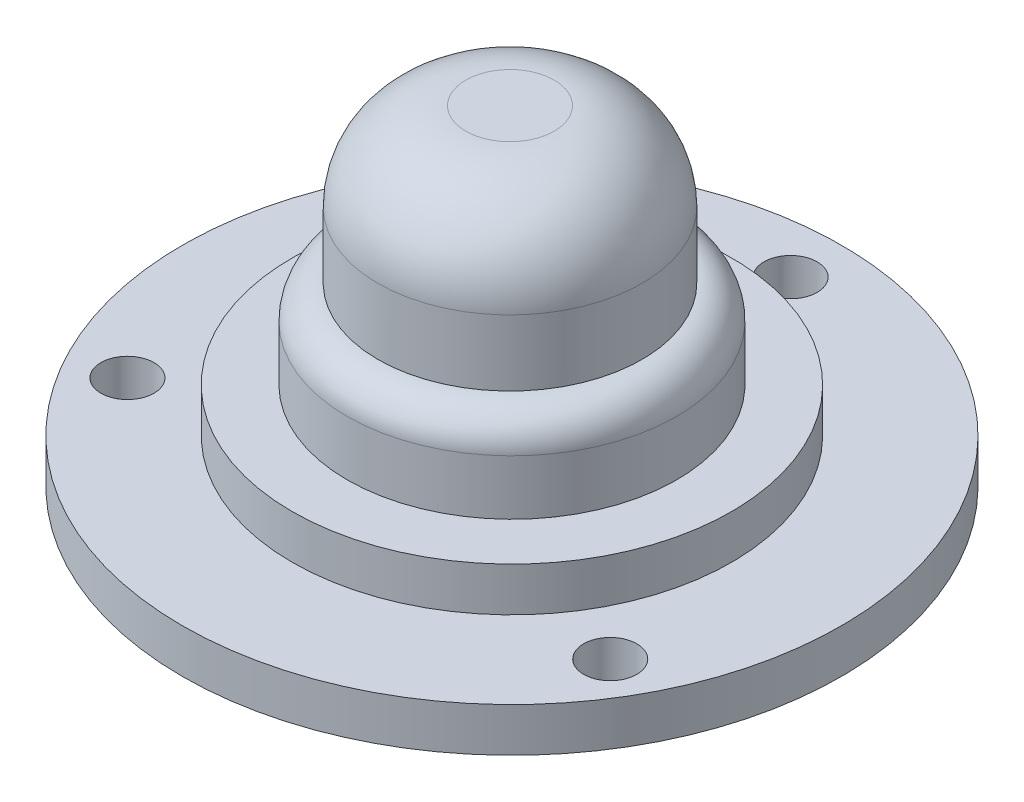
ISO-10303-21;
HEADER;
FILE_DESCRIPTION(('STEP AP214'),'2;1');
FILE_NAME('part.step','',(''),(''),'','','');
FILE_SCHEMA(('AUTOMOTIVE_DESIGN { 1 0 10303 214 1 1 1 1 }'));
ENDSEC;
DATA;
#1=APPLICATION_CONTEXT('core data for automotive mechanical design processes');
#2=APPLICATION_PROTOCOL_DEFINITION('international standard','automotive_design',2000,#1);
#3=PRODUCT_CONTEXT('',#1,'mechanical');
#4=PRODUCT('Part','Part','',(#3));
#5=PRODUCT_RELATED_PRODUCT_CATEGORY('part','',(#4));
#6=PRODUCT_DEFINITION_FORMATION('','',#4);
#7=PRODUCT_DEFINITION_CONTEXT('part definition',#1,'design');
#8=PRODUCT_DEFINITION('design','',#6,#7);
#9=PRODUCT_DEFINITION_SHAPE('','',#8);
#10=(LENGTH_UNIT() NAMED_UNIT(*) SI_UNIT(.MILLI.,.METRE.));
#11=(NAMED_UNIT(*) PLANE_ANGLE_UNIT() SI_UNIT($,.RADIAN.));
#12=(NAMED_UNIT(*) SI_UNIT($,.STERADIAN.) SOLID_ANGLE_UNIT());
#13=UNCERTAINTY_MEASURE_WITH_UNIT(LENGTH_MEASURE(1.E-05),#10,'distance_accuracy_value','');
#14=(GEOMETRIC_REPRESENTATION_CONTEXT(3) GLOBAL_UNCERTAINTY_ASSIGNED_CONTEXT((#13)) GLOBAL_UNIT_ASSIGNED_CONTEXT((#10,
#11,#12)) REPRESENTATION_CONTEXT('',''));
#15=CARTESIAN_POINT('',(0.,0.,0.));
#16=DIRECTION('',(0.,0.,1.));
#17=DIRECTION('',(1.,0.,0.));
#18=AXIS2_PLACEMENT_3D('',#15,#16,#17);
#19=CARTESIAN_POINT('',(-0.771907225552136,0.2,-1.32863677318487));
#20=DIRECTION('',(0.,-1.,0.));
#21=DIRECTION('',(0.,0.,-1.));
#22=AXIS2_PLACEMENT_3D('',#19,#20,#21);
#23=CYLINDRICAL_SURFACE('',#22,1.5);
#24=CARTESIAN_POINT('',(-0.771907225552136,0.2,-1.32863677318487));
#25=DIRECTION('',(0.,1.,0.));
#26=DIRECTION('',(0.,0.,1.));
#27=AXIS2_PLACEMENT_3D('',#24,#25,#26);
#28=CIRCLE('',#27,1.5);
#29=CARTESIAN_POINT('',(-0.771907225552136,0.2,0.171363226815129));
#30=VERTEX_POINT('',#29);
#31=EDGE_CURVE('E91',#30,#30,#28,.T.);
#32=ORIENTED_EDGE('',*,*,#31,.F.);
#33=EDGE_LOOP('',(#32));
#34=FACE_BOUND('',#33,.T.);
#35=CARTESIAN_POINT('',(-0.771907225552136,0.,-1.32863677318487));
#36=DIRECTION('',(0.,1.,0.));
#37=DIRECTION('',(0.,0.,1.));
#38=AXIS2_PLACEMENT_3D('',#35,#36,#37);
#39=CIRCLE('',#38,1.5);
#40=CARTESIAN_POINT('',(-0.771907225552136,0.,0.171363226815129));
#41=VERTEX_POINT('',#40);
#42=EDGE_CURVE('E88',#41,#41,#39,.T.);
#43=ORIENTED_EDGE('',*,*,#42,.T.);
#44=EDGE_LOOP('',(#43));
#45=FACE_BOUND('',#44,.T.);
#46=ADVANCED_FACE('F39',(#34,#45),#23,.T.);
#47=CARTESIAN_POINT('',(-0.771907225552136,0.2,-1.32863677318487));
#48=DIRECTION('',(0.,1.,0.));
#49=DIRECTION('',(0.,0.,1.));
#50=AXIS2_PLACEMENT_3D('',#47,#48,#49);
#51=PLANE('',#50);
#52=CARTESIAN_POINT('',(-0.762097507527632,0.2,-2.58705102383207));
#53=DIRECTION('',(0.,1.,0.));
#54=DIRECTION('',(0.,0.,1.));
#55=AXIS2_PLACEMENT_3D('',#52,#53,#54);
#56=CIRCLE('',#55,0.120832219167588);
#57=CARTESIAN_POINT('',(-0.762097507527632,0.2,-2.46621880466448));
#58=VERTEX_POINT('',#57);
#59=EDGE_CURVE('E110',#58,#58,#56,.T.);
#60=ORIENTED_EDGE('',*,*,#59,.F.);
#61=EDGE_LOOP('',(#60));
#62=FACE_BOUND('',#61,.T.);
#63=CARTESIAN_POINT('',(0.333062694347179,0.2,-0.671048980823039));
#64=DIRECTION('',(0.,1.,0.));
#65=DIRECTION('',(0.,0.,1.));
#66=AXIS2_PLACEMENT_3D('',#63,#64,#65);
#67=CIRCLE('',#66,0.120832219167588);
#68=CARTESIAN_POINT('',(0.333062694347179,0.2,-0.550216761655451));
#69=VERTEX_POINT('',#68);
#70=EDGE_CURVE('E273',#69,#69,#67,.T.);
#71=ORIENTED_EDGE('',*,*,#70,.F.);
#72=EDGE_LOOP('',(#71));
#73=FACE_BOUND('',#72,.T.);
#74=CARTESIAN_POINT('',(-1.87382384953893,0.2,-0.680613446290285));
#75=DIRECTION('',(0.,1.,0.));
#76=DIRECTION('',(0.,0.,1.));
#77=AXIS2_PLACEMENT_3D('',#74,#75,#76);
#78=CIRCLE('',#77,0.120832219167588);
#79=CARTESIAN_POINT('',(-1.87382384953893,0.2,-0.559781227122697));
#80=VERTEX_POINT('',#79);
#81=EDGE_CURVE('E276',#80,#80,#78,.T.);
#82=ORIENTED_EDGE('',*,*,#81,.F.);
#83=EDGE_LOOP('',(#82));
#84=FACE_BOUND('',#83,.T.);
#85=CARTESIAN_POINT('',(-0.771907225552136,0.2,-1.32863677318487));
#86=DIRECTION('',(0.,1.,0.));
#87=DIRECTION('',(0.,0.,1.));
#88=AXIS2_PLACEMENT_3D('',#85,#86,#87);
#89=CIRCLE('',#88,1.);
#90=CARTESIAN_POINT('',(-0.771907225552136,0.2,-0.328636773184871));
#91=VERTEX_POINT('',#90);
#92=EDGE_CURVE('E85',#91,#91,#89,.T.);
#93=ORIENTED_EDGE('',*,*,#92,.F.);
#94=EDGE_LOOP('',(#93));
#95=FACE_BOUND('',#94,.T.);
#96=ORIENTED_EDGE('',*,*,#31,.T.);
#97=EDGE_LOOP('',(#96));
#98=FACE_BOUND('',#97,.T.);
#99=ADVANCED_FACE('F133',(#62,#73,#84,#95,#98),#51,.T.);
#100=CARTESIAN_POINT('',(-0.771907225552136,0.,-1.32863677318487));
#101=DIRECTION('',(0.,1.,0.));
#102=DIRECTION('',(0.,0.,1.));
#103=AXIS2_PLACEMENT_3D('',#100,#101,#102);
#104=PLANE('',#103);
#105=CARTESIAN_POINT('',(-0.762097507527632,0.,-2.58705102383207));
#106=DIRECTION('',(0.,1.,0.));
#107=DIRECTION('',(0.,0.,1.));
#108=AXIS2_PLACEMENT_3D('',#105,#106,#107);
#109=CIRCLE('',#108,0.120832219167588);
#110=CARTESIAN_POINT('',(-0.762097507527632,0.,-2.46621880466448));
#111=VERTEX_POINT('',#110);
#112=EDGE_CURVE('E43',#111,#111,#109,.T.);
#113=ORIENTED_EDGE('',*,*,#112,.T.);
#114=EDGE_LOOP('',(#113));
#115=FACE_BOUND('',#114,.T.);
#116=CARTESIAN_POINT('',(0.333062694347179,0.,-0.671048980823039));
#117=DIRECTION('',(0.,1.,0.));
#118=DIRECTION('',(0.,0.,1.));
#119=AXIS2_PLACEMENT_3D('',#116,#117,#118);
#120=CIRCLE('',#119,0.120832219167588);
#121=CARTESIAN_POINT('',(0.333062694347179,0.,-0.550216761655451));
#122=VERTEX_POINT('',#121);
#123=EDGE_CURVE('E75',#122,#122,#120,.T.);
#124=ORIENTED_EDGE('',*,*,#123,.T.);
#125=EDGE_LOOP('',(#124));
#126=FACE_BOUND('',#125,.T.);
#127=CARTESIAN_POINT('',(-1.87382384953893,0.,-0.680613446290285));
#128=DIRECTION('',(0.,1.,0.));
#129=DIRECTION('',(0.,0.,1.));
#130=AXIS2_PLACEMENT_3D('',#127,#128,#129);
#131=CIRCLE('',#130,0.120832219167588);
#132=CARTESIAN_POINT('',(-1.87382384953893,0.,-0.559781227122697));
#133=VERTEX_POINT('',#132);
#134=EDGE_CURVE('E108',#133,#133,#131,.T.);
#135=ORIENTED_EDGE('',*,*,#134,.T.);
#136=EDGE_LOOP('',(#135));
#137=FACE_BOUND('',#136,.T.);
#138=ORIENTED_EDGE('',*,*,#42,.F.);
#139=EDGE_LOOP('',(#138));
#140=FACE_BOUND('',#139,.T.);
#141=ADVANCED_FACE('F114',(#115,#126,#137,#140),#104,.F.);
#142=CARTESIAN_POINT('',(-0.771907225552136,0.4,-1.32863677318487));
#143=DIRECTION('',(0.,-1.,0.));
#144=DIRECTION('',(0.,0.,-1.));
#145=AXIS2_PLACEMENT_3D('',#142,#143,#144);
#146=CYLINDRICAL_SURFACE('',#145,1.);
#147=CARTESIAN_POINT('',(-0.771907225552136,0.4,-1.32863677318487));
#148=DIRECTION('',(0.,1.,0.));
#149=DIRECTION('',(0.,0.,1.));
#150=AXIS2_PLACEMENT_3D('',#147,#148,#149);
#151=CIRCLE('',#150,1.);
#152=CARTESIAN_POINT('',(-0.771907225552136,0.4,-0.328636773184871));
#153=VERTEX_POINT('',#152);
#154=EDGE_CURVE('E64',#153,#153,#151,.T.);
#155=ORIENTED_EDGE('',*,*,#154,.F.);
#156=EDGE_LOOP('',(#155));
#157=FACE_BOUND('',#156,.T.);
#158=ORIENTED_EDGE('',*,*,#92,.T.);
#159=EDGE_LOOP('',(#158));
#160=FACE_BOUND('',#159,.T.);
#161=ADVANCED_FACE('F159',(#157,#160),#146,.T.);
#162=CARTESIAN_POINT('',(-0.771907225552136,0.4,-1.32863677318487));
#163=DIRECTION('',(0.,1.,0.));
#164=DIRECTION('',(0.,0.,1.));
#165=AXIS2_PLACEMENT_3D('',#162,#163,#164);
#166=PLANE('',#165);
#167=CARTESIAN_POINT('',(-0.771907225552136,0.4,-1.32863677318487));
#168=DIRECTION('',(0.,1.,0.));
#169=DIRECTION('',(0.,0.,1.));
#170=AXIS2_PLACEMENT_3D('',#167,#168,#169);
#171=CIRCLE('',#170,0.75);
#172=CARTESIAN_POINT('',(-0.771907225552136,0.4,-0.578636773184871));
#173=VERTEX_POINT('',#172);
#174=EDGE_CURVE('E71',#173,#173,#171,.T.);
#175=ORIENTED_EDGE('',*,*,#174,.F.);
#176=EDGE_LOOP('',(#175));
#177=FACE_BOUND('',#176,.T.);
#178=ORIENTED_EDGE('',*,*,#154,.T.);
#179=EDGE_LOOP('',(#178));
#180=FACE_BOUND('',#179,.T.);
#181=ADVANCED_FACE('F154',(#177,#180),#166,.T.);
#182=CARTESIAN_POINT('',(-0.771907225552136,0.8,-1.32863677318487));
#183=DIRECTION('',(0.,-1.,0.));
#184=DIRECTION('',(0.,0.,-1.));
#185=AXIS2_PLACEMENT_3D('',#182,#183,#184);
#186=CYLINDRICAL_SURFACE('',#185,0.75);
#187=CARTESIAN_POINT('',(-0.771907225552136,0.65,-1.32863677318487));
#188=DIRECTION('',(0.,1.,0.));
#189=DIRECTION('',(0.,0.,1.));
#190=AXIS2_PLACEMENT_3D('',#187,#188,#189);
#191=CIRCLE('',#190,0.75);
#192=CARTESIAN_POINT('',(-0.771907225552136,0.65,-0.578636773184871));
#193=VERTEX_POINT('',#192);
#194=EDGE_CURVE('E70',#193,#193,#191,.F.);
#195=ORIENTED_EDGE('',*,*,#194,.T.);
#196=EDGE_LOOP('',(#195));
#197=FACE_BOUND('',#196,.T.);
#198=ORIENTED_EDGE('',*,*,#174,.T.);
#199=EDGE_LOOP('',(#198));
#200=FACE_BOUND('',#199,.T.);
#201=ADVANCED_FACE('F146',(#197,#200),#186,.T.);
#202=CARTESIAN_POINT('',(-0.771907225552136,0.65,-1.32863677318487));
#203=DIRECTION('',(0.,1.,0.));
#204=DIRECTION('',(0.,0.,1.));
#205=AXIS2_PLACEMENT_3D('',#202,#203,#204);
#206=TOROIDAL_SURFACE('',#205,0.6,0.15);
#207=ORIENTED_EDGE('',*,*,#194,.F.);
#208=EDGE_LOOP('',(#207));
#209=FACE_BOUND('',#208,.T.);
#210=CARTESIAN_POINT('',(-0.776458572665476,0.8,-1.32443257357159));
#211=DIRECTION('',(0.,1.,0.));
#212=DIRECTION('',(0.819867135927403,0.,0.572553822296383));
#213=AXIS2_PLACEMENT_3D('',#210,#211,#212);
#214=CIRCLE('',#213,0.601293838503434);
#215=CARTESIAN_POINT('',(-0.283477515440871,0.8,-0.980159488013188));
#216=VERTEX_POINT('',#215);
#217=CARTESIAN_POINT('',(-1.08062001812605,0.8,-1.84312332471097));
#218=VERTEX_POINT('',#217);
#219=EDGE_CURVE('E58',#216,#218,#214,.T.);
#220=ORIENTED_EDGE('',*,*,#219,.F.);
#221=CARTESIAN_POINT('',(-0.771907225552136,0.8,-1.32863677318487));
#222=DIRECTION('',(0.,1.,0.));
#223=DIRECTION('',(0.,0.,1.));
#224=AXIS2_PLACEMENT_3D('',#221,#222,#223);
#225=CIRCLE('',#224,0.6);
#226=EDGE_CURVE('E55',#218,#216,#225,.T.);
#227=ORIENTED_EDGE('',*,*,#226,.F.);
#228=EDGE_LOOP('',(#220,#227));
#229=FACE_BOUND('',#228,.T.);
#230=ADVANCED_FACE('F60',(#209,#229),#206,.T.);
#231=CARTESIAN_POINT('',(-0.776458572665476,1.5,-1.32443257357159));
#232=DIRECTION('',(0.,-1.,0.));
#233=DIRECTION('',(0.,0.,-1.));
#234=AXIS2_PLACEMENT_3D('',#231,#232,#233);
#235=CYLINDRICAL_SURFACE('',#234,0.601293838503434);
#236=CARTESIAN_POINT('',(-0.776458572665476,1.1,-1.32443257357159));
#237=DIRECTION('',(0.,1.,0.));
#238=DIRECTION('',(0.,0.,1.));
#239=AXIS2_PLACEMENT_3D('',#236,#237,#238);
#240=CIRCLE('',#239,0.601293838503434);
#241=CARTESIAN_POINT('',(-0.776458572665476,1.1,-0.72313873506816));
#242=VERTEX_POINT('',#241);
#243=EDGE_CURVE('E11',#242,#242,#240,.F.);
#244=ORIENTED_EDGE('',*,*,#243,.T.);
#245=EDGE_LOOP('',(#244));
#246=FACE_BOUND('',#245,.T.);
#247=ORIENTED_EDGE('',*,*,#219,.T.);
#248=CARTESIAN_POINT('',(-0.776458572665476,0.8,-1.32443257357159));
#249=DIRECTION('',(0.,1.,0.));
#250=DIRECTION('',(0.,0.,1.));
#251=AXIS2_PLACEMENT_3D('',#248,#249,#250);
#252=CIRCLE('',#251,0.601293838503434);
#253=EDGE_CURVE('E65',#218,#216,#252,.T.);
#254=ORIENTED_EDGE('',*,*,#253,.T.);
#255=EDGE_LOOP('',(#247,#254));
#256=FACE_BOUND('',#255,.T.);
#257=ADVANCED_FACE('F72',(#246,#256),#235,.T.);
#258=CARTESIAN_POINT('',(-0.776458572665476,1.5,-1.32443257357159));
#259=DIRECTION('',(0.,1.,0.));
#260=DIRECTION('',(0.,0.,1.));
#261=AXIS2_PLACEMENT_3D('',#258,#259,#260);
#262=PLANE('',#261);
#263=CARTESIAN_POINT('',(-0.776458572665476,1.5,-1.32443257357159));
#264=DIRECTION('',(0.,1.,0.));
#265=DIRECTION('',(0.,0.,1.));
#266=AXIS2_PLACEMENT_3D('',#263,#264,#265);
#267=CIRCLE('',#266,0.201293838503434);
#268=CARTESIAN_POINT('',(-0.776458572665476,1.5,-1.12313873506816));
#269=VERTEX_POINT('',#268);
#270=EDGE_CURVE('E48',#269,#269,#267,.T.);
#271=ORIENTED_EDGE('',*,*,#270,.T.);
#272=EDGE_LOOP('',(#271));
#273=FACE_BOUND('',#272,.T.);
#274=ADVANCED_FACE('F152',(#273),#262,.T.);
#275=CARTESIAN_POINT('',(-0.776458572665476,0.8,-1.32443257357159));
#276=DIRECTION('',(0.,1.,0.));
#277=DIRECTION('',(0.,0.,1.));
#278=AXIS2_PLACEMENT_3D('',#275,#276,#277);
#279=PLANE('',#278);
#280=ORIENTED_EDGE('',*,*,#226,.T.);
#281=ORIENTED_EDGE('',*,*,#253,.F.);
#282=EDGE_LOOP('',(#280,#281));
#283=FACE_BOUND('',#282,.T.);
#284=ADVANCED_FACE('F69',(#283),#279,.F.);
#285=CARTESIAN_POINT('',(-0.776458572665476,1.1,-1.32443257357159));
#286=DIRECTION('',(0.,1.,0.));
#287=DIRECTION('',(0.,0.,1.));
#288=AXIS2_PLACEMENT_3D('',#285,#286,#287);
#289=DEGENERATE_TOROIDAL_SURFACE('',#288,0.201293838503434,0.4,.T.);
#290=ORIENTED_EDGE('',*,*,#243,.F.);
#291=EDGE_LOOP('',(#290));
#292=FACE_BOUND('',#291,.T.);
#293=ORIENTED_EDGE('',*,*,#270,.F.);
#294=EDGE_LOOP('',(#293));
#295=FACE_BOUND('',#294,.T.);
#296=ADVANCED_FACE('F41',(#292,#295),#289,.T.);
#297=CARTESIAN_POINT('',(-1.87382384953893,-0.5,-0.680613446290285));
#298=DIRECTION('',(0.,1.,0.));
#299=DIRECTION('',(0.,0.,1.));
#300=AXIS2_PLACEMENT_3D('',#297,#298,#299);
#301=CYLINDRICAL_SURFACE('',#300,0.120832219167588);
#302=ORIENTED_EDGE('',*,*,#81,.T.);
#303=EDGE_LOOP('',(#302));
#304=FACE_BOUND('',#303,.T.);
#305=ORIENTED_EDGE('',*,*,#134,.F.);
#306=EDGE_LOOP('',(#305));
#307=FACE_BOUND('',#306,.T.);
#308=ADVANCED_FACE('F120',(#304,#307),#301,.F.);
#309=CARTESIAN_POINT('',(0.333062694347179,-0.5,-0.671048980823039));
#310=DIRECTION('',(0.,1.,0.));
#311=DIRECTION('',(0.,0.,1.));
#312=AXIS2_PLACEMENT_3D('',#309,#310,#311);
#313=CYLINDRICAL_SURFACE('',#312,0.120832219167588);
#314=ORIENTED_EDGE('',*,*,#70,.T.);
#315=EDGE_LOOP('',(#314));
#316=FACE_BOUND('',#315,.T.);
#317=ORIENTED_EDGE('',*,*,#123,.F.);
#318=EDGE_LOOP('',(#317));
#319=FACE_BOUND('',#318,.T.);
#320=ADVANCED_FACE('F117',(#316,#319),#313,.F.);
#321=CARTESIAN_POINT('',(-0.762097507527632,-0.5,-2.58705102383207));
#322=DIRECTION('',(0.,1.,0.));
#323=DIRECTION('',(0.,0.,1.));
#324=AXIS2_PLACEMENT_3D('',#321,#322,#323);
#325=CYLINDRICAL_SURFACE('',#324,0.120832219167588);
#326=ORIENTED_EDGE('',*,*,#59,.T.);
#327=EDGE_LOOP('',(#326));
#328=FACE_BOUND('',#327,.T.);
#329=ORIENTED_EDGE('',*,*,#112,.F.);
#330=EDGE_LOOP('',(#329));
#331=FACE_BOUND('',#330,.T.);
#332=ADVANCED_FACE('F119',(#328,#331),#325,.F.);
#333=CLOSED_SHELL('',(#46,#99,#141,#161,#181,#201,#230,#257,#274,#284,#296,#308,#320,#332));
#334=MANIFOLD_SOLID_BREP('B2',#333);
#335=ADVANCED_BREP_SHAPE_REPRESENTATION('',(#18,#334),#14);
#336=SHAPE_DEFINITION_REPRESENTATION(#9,#335);
ENDSEC;
END-ISO-10303-21;
